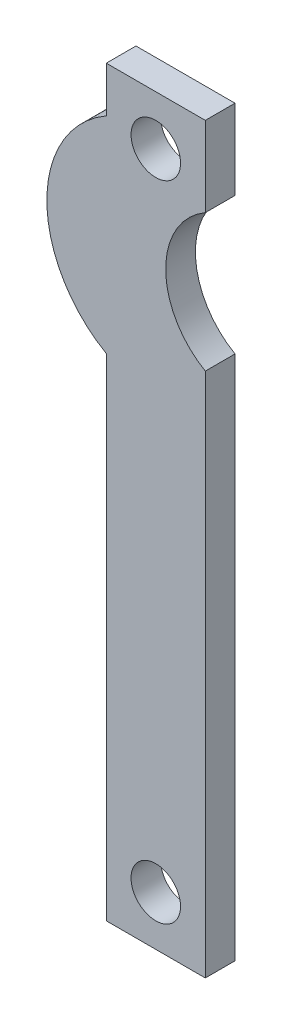
ISO-10303-21;
HEADER;
FILE_DESCRIPTION(('STEP AP214'),'2;1');
FILE_NAME('part.step','',(''),(''),'','','');
FILE_SCHEMA(('AUTOMOTIVE_DESIGN { 1 0 10303 214 1 1 1 1 }'));
ENDSEC;
DATA;
#1=APPLICATION_CONTEXT('core data for automotive mechanical design processes');
#2=APPLICATION_PROTOCOL_DEFINITION('international standard','automotive_design',2000,#1);
#3=PRODUCT_CONTEXT('',#1,'mechanical');
#4=PRODUCT('Part','Part','',(#3));
#5=PRODUCT_RELATED_PRODUCT_CATEGORY('part','',(#4));
#6=PRODUCT_DEFINITION_FORMATION('','',#4);
#7=PRODUCT_DEFINITION_CONTEXT('part definition',#1,'design');
#8=PRODUCT_DEFINITION('design','',#6,#7);
#9=PRODUCT_DEFINITION_SHAPE('','',#8);
#10=(LENGTH_UNIT() NAMED_UNIT(*) SI_UNIT(.MILLI.,.METRE.));
#11=(NAMED_UNIT(*) PLANE_ANGLE_UNIT() SI_UNIT($,.RADIAN.));
#12=(NAMED_UNIT(*) SI_UNIT($,.STERADIAN.) SOLID_ANGLE_UNIT());
#13=UNCERTAINTY_MEASURE_WITH_UNIT(LENGTH_MEASURE(1.E-05),#10,'distance_accuracy_value','');
#14=(GEOMETRIC_REPRESENTATION_CONTEXT(3) GLOBAL_UNCERTAINTY_ASSIGNED_CONTEXT((#13)) GLOBAL_UNIT_ASSIGNED_CONTEXT((#10,
#11,#12)) REPRESENTATION_CONTEXT('',''));
#15=CARTESIAN_POINT('',(0.,0.,0.));
#16=DIRECTION('',(0.,0.,1.));
#17=DIRECTION('',(1.,0.,0.));
#18=AXIS2_PLACEMENT_3D('',#15,#16,#17);
#19=CARTESIAN_POINT('',(-4.00000000000001,60.,3.));
#20=DIRECTION('',(0.,0.,1.));
#21=DIRECTION('',(1.,0.,0.));
#22=AXIS2_PLACEMENT_3D('',#19,#20,#21);
#23=PLANE('',#22);
#24=CARTESIAN_POINT('',(-5.00000000000001,70.,3.));
#25=DIRECTION('',(0.,0.,1.));
#26=DIRECTION('',(1.,0.,0.));
#27=AXIS2_PLACEMENT_3D('',#24,#25,#26);
#28=CIRCLE('',#27,2.5);
#29=CARTESIAN_POINT('',(-2.50000000000001,70.,3.));
#30=VERTEX_POINT('',#29);
#31=EDGE_CURVE('E136',#30,#30,#28,.T.);
#32=ORIENTED_EDGE('',*,*,#31,.F.);
#33=EDGE_LOOP('',(#32));
#34=FACE_BOUND('',#33,.T.);
#35=DIRECTION('',(0.,-1.,0.));
#36=VECTOR('',#35,1.);
#37=CARTESIAN_POINT('',(-10.,75.,3.));
#38=LINE('',#37,#36);
#39=CARTESIAN_POINT('',(-10.,75.,3.));
#40=VERTEX_POINT('',#39);
#41=CARTESIAN_POINT('',(-10.,70.3923048454133,3.));
#42=VERTEX_POINT('',#41);
#43=EDGE_CURVE('E147',#40,#42,#38,.T.);
#44=ORIENTED_EDGE('',*,*,#43,.T.);
#45=CARTESIAN_POINT('',(-4.00000000000001,60.,3.));
#46=DIRECTION('',(0.,0.,1.));
#47=DIRECTION('',(1.,0.,0.));
#48=AXIS2_PLACEMENT_3D('',#45,#46,#47);
#49=CIRCLE('',#48,12.);
#50=CARTESIAN_POINT('',(-9.99999999999999,49.6076951545867,3.));
#51=VERTEX_POINT('',#50);
#52=EDGE_CURVE('E95',#42,#51,#49,.T.);
#53=ORIENTED_EDGE('',*,*,#52,.T.);
#54=DIRECTION('',(0.,-1.,0.));
#55=VECTOR('',#54,1.);
#56=CARTESIAN_POINT('',(-10.,0.,3.));
#57=LINE('',#56,#55);
#58=CARTESIAN_POINT('',(-10.,0.,3.));
#59=VERTEX_POINT('',#58);
#60=EDGE_CURVE('E162',#51,#59,#57,.T.);
#61=ORIENTED_EDGE('',*,*,#60,.T.);
#62=DIRECTION('',(1.,0.,0.));
#63=VECTOR('',#62,1.);
#64=CARTESIAN_POINT('',(0.,0.,3.));
#65=LINE('',#64,#63);
#66=CARTESIAN_POINT('',(0.,0.,3.));
#67=VERTEX_POINT('',#66);
#68=EDGE_CURVE('E175',#59,#67,#65,.T.);
#69=ORIENTED_EDGE('',*,*,#68,.T.);
#70=DIRECTION('',(0.,1.,0.));
#71=VECTOR('',#70,1.);
#72=CARTESIAN_POINT('',(0.,53.0717967697245,3.));
#73=LINE('',#72,#71);
#74=CARTESIAN_POINT('',(0.,53.0717967697245,3.));
#75=VERTEX_POINT('',#74);
#76=EDGE_CURVE('E114',#67,#75,#73,.T.);
#77=ORIENTED_EDGE('',*,*,#76,.T.);
#78=CARTESIAN_POINT('',(3.99999999999999,60.,3.));
#79=DIRECTION('',(0.,0.,-1.));
#80=DIRECTION('',(1.,0.,0.));
#81=AXIS2_PLACEMENT_3D('',#78,#79,#80);
#82=CIRCLE('',#81,8.);
#83=CARTESIAN_POINT('',(0.,66.9282032302755,3.));
#84=VERTEX_POINT('',#83);
#85=EDGE_CURVE('E108',#75,#84,#82,.T.);
#86=ORIENTED_EDGE('',*,*,#85,.T.);
#87=DIRECTION('',(0.,1.,0.));
#88=VECTOR('',#87,1.);
#89=CARTESIAN_POINT('',(0.,75.,3.));
#90=LINE('',#89,#88);
#91=CARTESIAN_POINT('',(0.,75.,3.));
#92=VERTEX_POINT('',#91);
#93=EDGE_CURVE('E112',#84,#92,#90,.T.);
#94=ORIENTED_EDGE('',*,*,#93,.T.);
#95=DIRECTION('',(-1.,0.,0.));
#96=VECTOR('',#95,1.);
#97=CARTESIAN_POINT('',(-10.,75.,3.));
#98=LINE('',#97,#96);
#99=EDGE_CURVE('E52',#92,#40,#98,.T.);
#100=ORIENTED_EDGE('',*,*,#99,.T.);
#101=EDGE_LOOP('',(#44,#53,#61,#69,#77,#86,#94,#100));
#102=FACE_BOUND('',#101,.T.);
#103=CARTESIAN_POINT('',(-5.,5.,3.));
#104=DIRECTION('',(0.,0.,1.));
#105=DIRECTION('',(1.,0.,0.));
#106=AXIS2_PLACEMENT_3D('',#103,#104,#105);
#107=CIRCLE('',#106,2.5);
#108=CARTESIAN_POINT('',(-2.5,5.,3.));
#109=VERTEX_POINT('',#108);
#110=EDGE_CURVE('E184',#109,#109,#107,.T.);
#111=ORIENTED_EDGE('',*,*,#110,.F.);
#112=EDGE_LOOP('',(#111));
#113=FACE_BOUND('',#112,.T.);
#114=ADVANCED_FACE('F35',(#34,#102,#113),#23,.T.);
#115=CARTESIAN_POINT('',(-4.00000000000001,60.,0.));
#116=DIRECTION('',(0.,0.,1.));
#117=DIRECTION('',(1.,0.,0.));
#118=AXIS2_PLACEMENT_3D('',#115,#116,#117);
#119=PLANE('',#118);
#120=CARTESIAN_POINT('',(-5.00000000000001,70.,0.));
#121=DIRECTION('',(0.,0.,1.));
#122=DIRECTION('',(1.,0.,0.));
#123=AXIS2_PLACEMENT_3D('',#120,#121,#122);
#124=CIRCLE('',#123,2.5);
#125=CARTESIAN_POINT('',(-2.50000000000001,70.,0.));
#126=VERTEX_POINT('',#125);
#127=EDGE_CURVE('E181',#126,#126,#124,.T.);
#128=ORIENTED_EDGE('',*,*,#127,.T.);
#129=EDGE_LOOP('',(#128));
#130=FACE_BOUND('',#129,.T.);
#131=DIRECTION('',(0.,-1.,0.));
#132=VECTOR('',#131,1.);
#133=CARTESIAN_POINT('',(-10.,75.,0.));
#134=LINE('',#133,#132);
#135=CARTESIAN_POINT('',(-10.,75.,0.));
#136=VERTEX_POINT('',#135);
#137=CARTESIAN_POINT('',(-10.,70.3923048454133,0.));
#138=VERTEX_POINT('',#137);
#139=EDGE_CURVE('E132',#136,#138,#134,.T.);
#140=ORIENTED_EDGE('',*,*,#139,.F.);
#141=DIRECTION('',(-1.,0.,0.));
#142=VECTOR('',#141,1.);
#143=CARTESIAN_POINT('',(-10.,75.,0.));
#144=LINE('',#143,#142);
#145=CARTESIAN_POINT('',(0.,75.,0.));
#146=VERTEX_POINT('',#145);
#147=EDGE_CURVE('E87',#146,#136,#144,.T.);
#148=ORIENTED_EDGE('',*,*,#147,.F.);
#149=DIRECTION('',(0.,1.,0.));
#150=VECTOR('',#149,1.);
#151=CARTESIAN_POINT('',(0.,75.,0.));
#152=LINE('',#151,#150);
#153=CARTESIAN_POINT('',(0.,66.9282032302755,0.));
#154=VERTEX_POINT('',#153);
#155=EDGE_CURVE('E81',#154,#146,#152,.T.);
#156=ORIENTED_EDGE('',*,*,#155,.F.);
#157=CARTESIAN_POINT('',(3.99999999999999,60.,0.));
#158=DIRECTION('',(0.,0.,-1.));
#159=DIRECTION('',(1.,0.,0.));
#160=AXIS2_PLACEMENT_3D('',#157,#158,#159);
#161=CIRCLE('',#160,8.);
#162=CARTESIAN_POINT('',(0.,53.0717967697245,0.));
#163=VERTEX_POINT('',#162);
#164=EDGE_CURVE('E122',#163,#154,#161,.T.);
#165=ORIENTED_EDGE('',*,*,#164,.F.);
#166=DIRECTION('',(0.,1.,0.));
#167=VECTOR('',#166,1.);
#168=CARTESIAN_POINT('',(0.,53.0717967697245,0.));
#169=LINE('',#168,#167);
#170=CARTESIAN_POINT('',(0.,0.,0.));
#171=VERTEX_POINT('',#170);
#172=EDGE_CURVE('E142',#171,#163,#169,.T.);
#173=ORIENTED_EDGE('',*,*,#172,.F.);
#174=DIRECTION('',(1.,0.,0.));
#175=VECTOR('',#174,1.);
#176=CARTESIAN_POINT('',(0.,0.,0.));
#177=LINE('',#176,#175);
#178=CARTESIAN_POINT('',(-10.,0.,0.));
#179=VERTEX_POINT('',#178);
#180=EDGE_CURVE('E140',#179,#171,#177,.T.);
#181=ORIENTED_EDGE('',*,*,#180,.F.);
#182=DIRECTION('',(0.,-1.,0.));
#183=VECTOR('',#182,1.);
#184=CARTESIAN_POINT('',(-10.,0.,0.));
#185=LINE('',#184,#183);
#186=CARTESIAN_POINT('',(-9.99999999999999,49.6076951545867,0.));
#187=VERTEX_POINT('',#186);
#188=EDGE_CURVE('E138',#187,#179,#185,.T.);
#189=ORIENTED_EDGE('',*,*,#188,.F.);
#190=CARTESIAN_POINT('',(-4.00000000000001,60.,0.));
#191=DIRECTION('',(0.,0.,1.));
#192=DIRECTION('',(1.,0.,0.));
#193=AXIS2_PLACEMENT_3D('',#190,#191,#192);
#194=CIRCLE('',#193,12.);
#195=EDGE_CURVE('E135',#138,#187,#194,.T.);
#196=ORIENTED_EDGE('',*,*,#195,.F.);
#197=EDGE_LOOP('',(#140,#148,#156,#165,#173,#181,#189,#196));
#198=FACE_BOUND('',#197,.T.);
#199=CARTESIAN_POINT('',(-5.,5.,0.));
#200=DIRECTION('',(0.,0.,1.));
#201=DIRECTION('',(1.,0.,0.));
#202=AXIS2_PLACEMENT_3D('',#199,#200,#201);
#203=CIRCLE('',#202,2.5);
#204=CARTESIAN_POINT('',(-2.5,5.,0.));
#205=VERTEX_POINT('',#204);
#206=EDGE_CURVE('E187',#205,#205,#203,.T.);
#207=ORIENTED_EDGE('',*,*,#206,.T.);
#208=EDGE_LOOP('',(#207));
#209=FACE_BOUND('',#208,.T.);
#210=ADVANCED_FACE('F166',(#130,#198,#209),#119,.F.);
#211=CARTESIAN_POINT('',(-10.,75.,3.));
#212=DIRECTION('',(1.,0.,0.));
#213=DIRECTION('',(0.,1.,0.));
#214=AXIS2_PLACEMENT_3D('',#211,#212,#213);
#215=PLANE('',#214);
#216=ORIENTED_EDGE('',*,*,#139,.T.);
#217=DIRECTION('',(0.,0.,-1.));
#218=VECTOR('',#217,1.);
#219=CARTESIAN_POINT('',(-10.,70.3923048454133,3.));
#220=LINE('',#219,#218);
#221=EDGE_CURVE('E11',#42,#138,#220,.T.);
#222=ORIENTED_EDGE('',*,*,#221,.F.);
#223=ORIENTED_EDGE('',*,*,#43,.F.);
#224=DIRECTION('',(0.,0.,-1.));
#225=VECTOR('',#224,1.);
#226=CARTESIAN_POINT('',(-10.,75.,3.));
#227=LINE('',#226,#225);
#228=EDGE_CURVE('E128',#40,#136,#227,.T.);
#229=ORIENTED_EDGE('',*,*,#228,.T.);
#230=EDGE_LOOP('',(#216,#222,#223,#229));
#231=FACE_BOUND('',#230,.T.);
#232=ADVANCED_FACE('F37',(#231),#215,.F.);
#233=CARTESIAN_POINT('',(-4.00000000000001,60.,3.));
#234=DIRECTION('',(0.,0.,-1.));
#235=DIRECTION('',(-1.,0.,0.));
#236=AXIS2_PLACEMENT_3D('',#233,#234,#235);
#237=CYLINDRICAL_SURFACE('',#236,12.);
#238=ORIENTED_EDGE('',*,*,#195,.T.);
#239=DIRECTION('',(0.,0.,-1.));
#240=VECTOR('',#239,1.);
#241=CARTESIAN_POINT('',(-9.99999999999999,49.6076951545867,3.));
#242=LINE('',#241,#240);
#243=EDGE_CURVE('E44',#51,#187,#242,.T.);
#244=ORIENTED_EDGE('',*,*,#243,.F.);
#245=ORIENTED_EDGE('',*,*,#52,.F.);
#246=ORIENTED_EDGE('',*,*,#221,.T.);
#247=EDGE_LOOP('',(#238,#244,#245,#246));
#248=FACE_BOUND('',#247,.T.);
#249=ADVANCED_FACE('F220',(#248),#237,.T.);
#250=CARTESIAN_POINT('',(-10.,0.,3.));
#251=DIRECTION('',(1.,0.,0.));
#252=DIRECTION('',(0.,1.,0.));
#253=AXIS2_PLACEMENT_3D('',#250,#251,#252);
#254=PLANE('',#253);
#255=ORIENTED_EDGE('',*,*,#188,.T.);
#256=DIRECTION('',(0.,0.,-1.));
#257=VECTOR('',#256,1.);
#258=CARTESIAN_POINT('',(-10.,0.,3.));
#259=LINE('',#258,#257);
#260=EDGE_CURVE('E154',#59,#179,#259,.T.);
#261=ORIENTED_EDGE('',*,*,#260,.F.);
#262=ORIENTED_EDGE('',*,*,#60,.F.);
#263=ORIENTED_EDGE('',*,*,#243,.T.);
#264=EDGE_LOOP('',(#255,#261,#262,#263));
#265=FACE_BOUND('',#264,.T.);
#266=ADVANCED_FACE('F160',(#265),#254,.F.);
#267=CARTESIAN_POINT('',(0.,0.,3.));
#268=DIRECTION('',(0.,1.,0.));
#269=DIRECTION('',(0.,0.,1.));
#270=AXIS2_PLACEMENT_3D('',#267,#268,#269);
#271=PLANE('',#270);
#272=ORIENTED_EDGE('',*,*,#180,.T.);
#273=DIRECTION('',(0.,0.,-1.));
#274=VECTOR('',#273,1.);
#275=CARTESIAN_POINT('',(0.,0.,3.));
#276=LINE('',#275,#274);
#277=EDGE_CURVE('E151',#67,#171,#276,.T.);
#278=ORIENTED_EDGE('',*,*,#277,.F.);
#279=ORIENTED_EDGE('',*,*,#68,.F.);
#280=ORIENTED_EDGE('',*,*,#260,.T.);
#281=EDGE_LOOP('',(#272,#278,#279,#280));
#282=FACE_BOUND('',#281,.T.);
#283=ADVANCED_FACE('F171',(#282),#271,.F.);
#284=CARTESIAN_POINT('',(0.,53.0717967697245,3.));
#285=DIRECTION('',(-1.,0.,0.));
#286=DIRECTION('',(0.,-1.,0.));
#287=AXIS2_PLACEMENT_3D('',#284,#285,#286);
#288=PLANE('',#287);
#289=ORIENTED_EDGE('',*,*,#172,.T.);
#290=DIRECTION('',(0.,0.,-1.));
#291=VECTOR('',#290,1.);
#292=CARTESIAN_POINT('',(0.,53.0717967697245,3.));
#293=LINE('',#292,#291);
#294=EDGE_CURVE('E123',#75,#163,#293,.T.);
#295=ORIENTED_EDGE('',*,*,#294,.F.);
#296=ORIENTED_EDGE('',*,*,#76,.F.);
#297=ORIENTED_EDGE('',*,*,#277,.T.);
#298=EDGE_LOOP('',(#289,#295,#296,#297));
#299=FACE_BOUND('',#298,.T.);
#300=ADVANCED_FACE('F174',(#299),#288,.F.);
#301=CARTESIAN_POINT('',(3.99999999999999,60.,3.));
#302=DIRECTION('',(0.,0.,-1.));
#303=DIRECTION('',(-1.,0.,0.));
#304=AXIS2_PLACEMENT_3D('',#301,#302,#303);
#305=CYLINDRICAL_SURFACE('',#304,8.);
#306=ORIENTED_EDGE('',*,*,#164,.T.);
#307=DIRECTION('',(0.,0.,-1.));
#308=VECTOR('',#307,1.);
#309=CARTESIAN_POINT('',(0.,66.9282032302755,3.));
#310=LINE('',#309,#308);
#311=EDGE_CURVE('E119',#84,#154,#310,.T.);
#312=ORIENTED_EDGE('',*,*,#311,.F.);
#313=ORIENTED_EDGE('',*,*,#85,.F.);
#314=ORIENTED_EDGE('',*,*,#294,.T.);
#315=EDGE_LOOP('',(#306,#312,#313,#314));
#316=FACE_BOUND('',#315,.T.);
#317=ADVANCED_FACE('F120',(#316),#305,.F.);
#318=CARTESIAN_POINT('',(0.,75.,3.));
#319=DIRECTION('',(-1.,0.,0.));
#320=DIRECTION('',(0.,-1.,0.));
#321=AXIS2_PLACEMENT_3D('',#318,#319,#320);
#322=PLANE('',#321);
#323=ORIENTED_EDGE('',*,*,#155,.T.);
#324=DIRECTION('',(0.,0.,-1.));
#325=VECTOR('',#324,1.);
#326=CARTESIAN_POINT('',(0.,75.,3.));
#327=LINE('',#326,#325);
#328=EDGE_CURVE('E124',#92,#146,#327,.T.);
#329=ORIENTED_EDGE('',*,*,#328,.F.);
#330=ORIENTED_EDGE('',*,*,#93,.F.);
#331=ORIENTED_EDGE('',*,*,#311,.T.);
#332=EDGE_LOOP('',(#323,#329,#330,#331));
#333=FACE_BOUND('',#332,.T.);
#334=ADVANCED_FACE('F126',(#333),#322,.F.);
#335=CARTESIAN_POINT('',(-10.,75.,3.));
#336=DIRECTION('',(0.,-1.,0.));
#337=DIRECTION('',(0.,0.,-1.));
#338=AXIS2_PLACEMENT_3D('',#335,#336,#337);
#339=PLANE('',#338);
#340=ORIENTED_EDGE('',*,*,#147,.T.);
#341=ORIENTED_EDGE('',*,*,#228,.F.);
#342=ORIENTED_EDGE('',*,*,#99,.F.);
#343=ORIENTED_EDGE('',*,*,#328,.T.);
#344=EDGE_LOOP('',(#340,#341,#342,#343));
#345=FACE_BOUND('',#344,.T.);
#346=ADVANCED_FACE('F208',(#345),#339,.F.);
#347=CARTESIAN_POINT('',(-5.00000000000001,70.,3.));
#348=DIRECTION('',(0.,0.,-1.));
#349=DIRECTION('',(-1.,0.,0.));
#350=AXIS2_PLACEMENT_3D('',#347,#348,#349);
#351=CYLINDRICAL_SURFACE('',#350,2.5);
#352=ORIENTED_EDGE('',*,*,#31,.T.);
#353=EDGE_LOOP('',(#352));
#354=FACE_BOUND('',#353,.T.);
#355=ORIENTED_EDGE('',*,*,#127,.F.);
#356=EDGE_LOOP('',(#355));
#357=FACE_BOUND('',#356,.T.);
#358=ADVANCED_FACE('F205',(#354,#357),#351,.F.);
#359=CARTESIAN_POINT('',(-5.,5.,3.));
#360=DIRECTION('',(0.,0.,-1.));
#361=DIRECTION('',(-1.,0.,0.));
#362=AXIS2_PLACEMENT_3D('',#359,#360,#361);
#363=CYLINDRICAL_SURFACE('',#362,2.5);
#364=ORIENTED_EDGE('',*,*,#110,.T.);
#365=EDGE_LOOP('',(#364));
#366=FACE_BOUND('',#365,.T.);
#367=ORIENTED_EDGE('',*,*,#206,.F.);
#368=EDGE_LOOP('',(#367));
#369=FACE_BOUND('',#368,.T.);
#370=ADVANCED_FACE('F193',(#366,#369),#363,.F.);
#371=CLOSED_SHELL('',(#114,#210,#232,#249,#266,#283,#300,#317,#334,#346,#358,#370));
#372=MANIFOLD_SOLID_BREP('B2',#371);
#373=ADVANCED_BREP_SHAPE_REPRESENTATION('',(#18,#372),#14);
#374=SHAPE_DEFINITION_REPRESENTATION(#9,#373);
ENDSEC;
END-ISO-10303-21;
